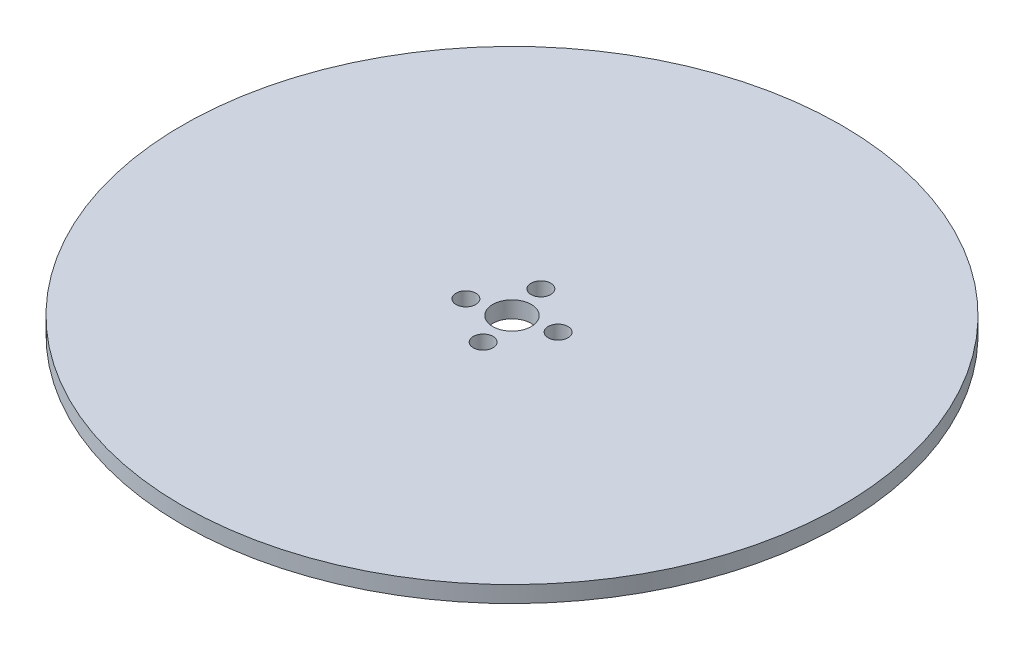
ISO-10303-21;
HEADER;
FILE_DESCRIPTION(('STEP AP214'),'2;1');
FILE_NAME('part.step','',(''),(''),'','','');
FILE_SCHEMA(('AUTOMOTIVE_DESIGN { 1 0 10303 214 1 1 1 1 }'));
ENDSEC;
DATA;
#1=APPLICATION_CONTEXT('core data for automotive mechanical design processes');
#2=APPLICATION_PROTOCOL_DEFINITION('international standard','automotive_design',2000,#1);
#3=PRODUCT_CONTEXT('',#1,'mechanical');
#4=PRODUCT('Part','Part','',(#3));
#5=PRODUCT_RELATED_PRODUCT_CATEGORY('part','',(#4));
#6=PRODUCT_DEFINITION_FORMATION('','',#4);
#7=PRODUCT_DEFINITION_CONTEXT('part definition',#1,'design');
#8=PRODUCT_DEFINITION('design','',#6,#7);
#9=PRODUCT_DEFINITION_SHAPE('','',#8);
#10=(LENGTH_UNIT() NAMED_UNIT(*) SI_UNIT(.MILLI.,.METRE.));
#11=(NAMED_UNIT(*) PLANE_ANGLE_UNIT() SI_UNIT($,.RADIAN.));
#12=(NAMED_UNIT(*) SI_UNIT($,.STERADIAN.) SOLID_ANGLE_UNIT());
#13=UNCERTAINTY_MEASURE_WITH_UNIT(LENGTH_MEASURE(1.E-05),#10,'distance_accuracy_value','');
#14=(GEOMETRIC_REPRESENTATION_CONTEXT(3) GLOBAL_UNCERTAINTY_ASSIGNED_CONTEXT((#13)) GLOBAL_UNIT_ASSIGNED_CONTEXT((#10,
#11,#12)) REPRESENTATION_CONTEXT('',''));
#15=CARTESIAN_POINT('',(0.,0.,0.));
#16=DIRECTION('',(0.,0.,1.));
#17=DIRECTION('',(1.,0.,0.));
#18=AXIS2_PLACEMENT_3D('',#15,#16,#17);
#19=CARTESIAN_POINT('',(0.,0.,0.));
#20=DIRECTION('',(0.,1.,0.));
#21=DIRECTION('',(0.,0.,1.));
#22=AXIS2_PLACEMENT_3D('',#19,#20,#21);
#23=PLANE('',#22);
#24=CARTESIAN_POINT('',(1.56993281036772,0.,6.82167948315744));
#25=DIRECTION('',(0.,-1.,0.));
#26=DIRECTION('',(0.,0.,-1.));
#27=AXIS2_PLACEMENT_3D('',#24,#25,#26);
#28=CIRCLE('',#27,1.8);
#29=CARTESIAN_POINT('',(1.56993281036772,0.,5.02167948315744));
#30=VERTEX_POINT('',#29);
#31=EDGE_CURVE('E58',#30,#30,#28,.T.);
#32=ORIENTED_EDGE('',*,*,#31,.F.);
#33=EDGE_LOOP('',(#32));
#34=FACE_BOUND('',#33,.T.);
#35=CARTESIAN_POINT('',(6.82167948315939,0.,-1.56993281036648));
#36=DIRECTION('',(0.,-1.,0.));
#37=DIRECTION('',(0.,0.,-1.));
#38=AXIS2_PLACEMENT_3D('',#35,#36,#37);
#39=CIRCLE('',#38,1.8);
#40=CARTESIAN_POINT('',(6.82167948315939,0.,-3.36993281036648));
#41=VERTEX_POINT('',#40);
#42=EDGE_CURVE('E64',#41,#41,#39,.T.);
#43=ORIENTED_EDGE('',*,*,#42,.F.);
#44=EDGE_LOOP('',(#43));
#45=FACE_BOUND('',#44,.T.);
#46=CARTESIAN_POINT('',(-1.56993281036454,0.,-6.82167948315814));
#47=DIRECTION('',(0.,-1.,0.));
#48=DIRECTION('',(0.,0.,-1.));
#49=AXIS2_PLACEMENT_3D('',#46,#47,#48);
#50=CIRCLE('',#49,1.8);
#51=CARTESIAN_POINT('',(-1.56993281036454,0.,-8.62167948315814));
#52=VERTEX_POINT('',#51);
#53=EDGE_CURVE('E65',#52,#52,#50,.T.);
#54=ORIENTED_EDGE('',*,*,#53,.F.);
#55=EDGE_LOOP('',(#54));
#56=FACE_BOUND('',#55,.T.);
#57=CARTESIAN_POINT('',(-6.8216794831562,0.,1.56993281036577));
#58=DIRECTION('',(0.,-1.,0.));
#59=DIRECTION('',(0.,0.,-1.));
#60=AXIS2_PLACEMENT_3D('',#57,#58,#59);
#61=CIRCLE('',#60,1.8);
#62=CARTESIAN_POINT('',(-6.8216794831562,0.,-0.230067189634225));
#63=VERTEX_POINT('',#62);
#64=EDGE_CURVE('E76',#63,#63,#61,.T.);
#65=ORIENTED_EDGE('',*,*,#64,.F.);
#66=EDGE_LOOP('',(#65));
#67=FACE_BOUND('',#66,.T.);
#68=CARTESIAN_POINT('',(0.,0.,0.));
#69=DIRECTION('',(0.,-1.,0.));
#70=DIRECTION('',(0.,0.,-1.));
#71=AXIS2_PLACEMENT_3D('',#68,#69,#70);
#72=CIRCLE('',#71,3.5);
#73=CARTESIAN_POINT('',(0.,0.,-3.5));
#74=VERTEX_POINT('',#73);
#75=EDGE_CURVE('E53',#74,#74,#72,.T.);
#76=ORIENTED_EDGE('',*,*,#75,.F.);
#77=EDGE_LOOP('',(#76));
#78=FACE_BOUND('',#77,.T.);
#79=CARTESIAN_POINT('',(0.,0.,0.));
#80=DIRECTION('',(0.,-1.,0.));
#81=DIRECTION('',(0.,0.,-1.));
#82=AXIS2_PLACEMENT_3D('',#79,#80,#81);
#83=CIRCLE('',#82,36.);
#84=CARTESIAN_POINT('',(0.,0.,-36.));
#85=VERTEX_POINT('',#84);
#86=EDGE_CURVE('E85',#85,#85,#83,.T.);
#87=ORIENTED_EDGE('',*,*,#86,.T.);
#88=EDGE_LOOP('',(#87));
#89=FACE_BOUND('',#88,.T.);
#90=ADVANCED_FACE('F37',(#34,#45,#56,#67,#78,#89),#23,.F.);
#91=CARTESIAN_POINT('',(0.,3.,0.));
#92=DIRECTION('',(0.,-1.,0.));
#93=DIRECTION('',(0.,0.,-1.));
#94=AXIS2_PLACEMENT_3D('',#91,#92,#93);
#95=CYLINDRICAL_SURFACE('',#94,60.);
#96=CARTESIAN_POINT('',(0.,3.,0.));
#97=DIRECTION('',(0.,1.,0.));
#98=DIRECTION('',(0.,0.,1.));
#99=AXIS2_PLACEMENT_3D('',#96,#97,#98);
#100=CIRCLE('',#99,60.);
#101=CARTESIAN_POINT('',(0.,3.,60.));
#102=VERTEX_POINT('',#101);
#103=EDGE_CURVE('E44',#102,#102,#100,.T.);
#104=ORIENTED_EDGE('',*,*,#103,.F.);
#105=EDGE_LOOP('',(#104));
#106=FACE_BOUND('',#105,.T.);
#107=CARTESIAN_POINT('',(0.,0.,0.));
#108=DIRECTION('',(0.,1.,0.));
#109=DIRECTION('',(0.,0.,1.));
#110=AXIS2_PLACEMENT_3D('',#107,#108,#109);
#111=CIRCLE('',#110,60.);
#112=CARTESIAN_POINT('',(0.,0.,60.));
#113=VERTEX_POINT('',#112);
#114=EDGE_CURVE('E48',#113,#113,#111,.T.);
#115=ORIENTED_EDGE('',*,*,#114,.T.);
#116=EDGE_LOOP('',(#115));
#117=FACE_BOUND('',#116,.T.);
#118=ADVANCED_FACE('F39',(#106,#117),#95,.T.);
#119=CARTESIAN_POINT('',(0.,3.,0.));
#120=DIRECTION('',(0.,1.,0.));
#121=DIRECTION('',(0.,0.,1.));
#122=AXIS2_PLACEMENT_3D('',#119,#120,#121);
#123=PLANE('',#122);
#124=CARTESIAN_POINT('',(1.56993281036772,3.,6.82167948315744));
#125=DIRECTION('',(0.,1.,0.));
#126=DIRECTION('',(0.,0.,1.));
#127=AXIS2_PLACEMENT_3D('',#124,#125,#126);
#128=CIRCLE('',#127,1.8);
#129=CARTESIAN_POINT('',(1.56993281036772,3.,8.62167948315744));
#130=VERTEX_POINT('',#129);
#131=EDGE_CURVE('E68',#130,#130,#128,.F.);
#132=ORIENTED_EDGE('',*,*,#131,.T.);
#133=EDGE_LOOP('',(#132));
#134=FACE_BOUND('',#133,.T.);
#135=CARTESIAN_POINT('',(6.82167948315939,3.,-1.56993281036648));
#136=DIRECTION('',(0.,1.,0.));
#137=DIRECTION('',(0.,0.,1.));
#138=AXIS2_PLACEMENT_3D('',#135,#136,#137);
#139=CIRCLE('',#138,1.8);
#140=CARTESIAN_POINT('',(6.82167948315939,3.,0.230067189633523));
#141=VERTEX_POINT('',#140);
#142=EDGE_CURVE('E61',#141,#141,#139,.F.);
#143=ORIENTED_EDGE('',*,*,#142,.T.);
#144=EDGE_LOOP('',(#143));
#145=FACE_BOUND('',#144,.T.);
#146=CARTESIAN_POINT('',(-1.56993281036454,3.,-6.82167948315814));
#147=DIRECTION('',(0.,1.,0.));
#148=DIRECTION('',(0.,0.,1.));
#149=AXIS2_PLACEMENT_3D('',#146,#147,#148);
#150=CIRCLE('',#149,1.8);
#151=CARTESIAN_POINT('',(-1.56993281036454,3.,-5.02167948315815));
#152=VERTEX_POINT('',#151);
#153=EDGE_CURVE('E80',#152,#152,#150,.F.);
#154=ORIENTED_EDGE('',*,*,#153,.T.);
#155=EDGE_LOOP('',(#154));
#156=FACE_BOUND('',#155,.T.);
#157=CARTESIAN_POINT('',(-6.8216794831562,3.,1.56993281036577));
#158=DIRECTION('',(0.,1.,0.));
#159=DIRECTION('',(0.,0.,1.));
#160=AXIS2_PLACEMENT_3D('',#157,#158,#159);
#161=CIRCLE('',#160,1.8);
#162=CARTESIAN_POINT('',(-6.8216794831562,3.,3.36993281036577));
#163=VERTEX_POINT('',#162);
#164=EDGE_CURVE('E73',#163,#163,#161,.F.);
#165=ORIENTED_EDGE('',*,*,#164,.T.);
#166=EDGE_LOOP('',(#165));
#167=FACE_BOUND('',#166,.T.);
#168=CARTESIAN_POINT('',(0.,3.,0.));
#169=DIRECTION('',(0.,1.,0.));
#170=DIRECTION('',(0.,0.,1.));
#171=AXIS2_PLACEMENT_3D('',#168,#169,#170);
#172=CIRCLE('',#171,3.5);
#173=CARTESIAN_POINT('',(0.,3.,3.5));
#174=VERTEX_POINT('',#173);
#175=EDGE_CURVE('E55',#174,#174,#172,.F.);
#176=ORIENTED_EDGE('',*,*,#175,.T.);
#177=EDGE_LOOP('',(#176));
#178=FACE_BOUND('',#177,.T.);
#179=ORIENTED_EDGE('',*,*,#103,.T.);
#180=EDGE_LOOP('',(#179));
#181=FACE_BOUND('',#180,.T.);
#182=ADVANCED_FACE('F117',(#134,#145,#156,#167,#178,#181),#123,.T.);
#183=CARTESIAN_POINT('',(0.,0.,0.));
#184=DIRECTION('',(0.,1.,0.));
#185=DIRECTION('',(0.,0.,1.));
#186=AXIS2_PLACEMENT_3D('',#183,#184,#185);
#187=CIRCLE('',#186,54.);
#188=CARTESIAN_POINT('',(0.,0.,54.));
#189=VERTEX_POINT('',#188);
#190=EDGE_CURVE('E10',#189,#189,#187,.F.);
#191=ORIENTED_EDGE('',*,*,#190,.F.);
#192=EDGE_LOOP('',(#191));
#193=FACE_BOUND('',#192,.T.);
#194=ORIENTED_EDGE('',*,*,#114,.F.);
#195=EDGE_LOOP('',(#194));
#196=FACE_BOUND('',#195,.T.);
#197=ADVANCED_FACE('F113',(#193,#196),#23,.F.);
#198=CARTESIAN_POINT('',(0.,3.001,0.));
#199=DIRECTION('',(0.,-1.,0.));
#200=DIRECTION('',(0.,0.,-1.));
#201=AXIS2_PLACEMENT_3D('',#198,#199,#200);
#202=CYLINDRICAL_SURFACE('',#201,3.5);
#203=ORIENTED_EDGE('',*,*,#175,.F.);
#204=EDGE_LOOP('',(#203));
#205=FACE_BOUND('',#204,.T.);
#206=ORIENTED_EDGE('',*,*,#75,.T.);
#207=EDGE_LOOP('',(#206));
#208=FACE_BOUND('',#207,.T.);
#209=ADVANCED_FACE('F123',(#205,#208),#202,.F.);
#210=CARTESIAN_POINT('',(-6.8216794831562,3.001,1.56993281036577));
#211=DIRECTION('',(0.,-1.,0.));
#212=DIRECTION('',(0.,0.,-1.));
#213=AXIS2_PLACEMENT_3D('',#210,#211,#212);
#214=CYLINDRICAL_SURFACE('',#213,1.8);
#215=ORIENTED_EDGE('',*,*,#164,.F.);
#216=EDGE_LOOP('',(#215));
#217=FACE_BOUND('',#216,.T.);
#218=ORIENTED_EDGE('',*,*,#64,.T.);
#219=EDGE_LOOP('',(#218));
#220=FACE_BOUND('',#219,.T.);
#221=ADVANCED_FACE('F129',(#217,#220),#214,.F.);
#222=CARTESIAN_POINT('',(-1.56993281036454,3.001,-6.82167948315814));
#223=DIRECTION('',(0.,-1.,0.));
#224=DIRECTION('',(0.,0.,-1.));
#225=AXIS2_PLACEMENT_3D('',#222,#223,#224);
#226=CYLINDRICAL_SURFACE('',#225,1.8);
#227=ORIENTED_EDGE('',*,*,#153,.F.);
#228=EDGE_LOOP('',(#227));
#229=FACE_BOUND('',#228,.T.);
#230=ORIENTED_EDGE('',*,*,#53,.T.);
#231=EDGE_LOOP('',(#230));
#232=FACE_BOUND('',#231,.T.);
#233=ADVANCED_FACE('F143',(#229,#232),#226,.F.);
#234=CARTESIAN_POINT('',(6.82167948315939,3.001,-1.56993281036648));
#235=DIRECTION('',(0.,-1.,0.));
#236=DIRECTION('',(0.,0.,-1.));
#237=AXIS2_PLACEMENT_3D('',#234,#235,#236);
#238=CYLINDRICAL_SURFACE('',#237,1.8);
#239=ORIENTED_EDGE('',*,*,#142,.F.);
#240=EDGE_LOOP('',(#239));
#241=FACE_BOUND('',#240,.T.);
#242=ORIENTED_EDGE('',*,*,#42,.T.);
#243=EDGE_LOOP('',(#242));
#244=FACE_BOUND('',#243,.T.);
#245=ADVANCED_FACE('F140',(#241,#244),#238,.F.);
#246=CARTESIAN_POINT('',(1.56993281036772,3.001,6.82167948315744));
#247=DIRECTION('',(0.,-1.,0.));
#248=DIRECTION('',(0.,0.,-1.));
#249=AXIS2_PLACEMENT_3D('',#246,#247,#248);
#250=CYLINDRICAL_SURFACE('',#249,1.8);
#251=ORIENTED_EDGE('',*,*,#131,.F.);
#252=EDGE_LOOP('',(#251));
#253=FACE_BOUND('',#252,.T.);
#254=ORIENTED_EDGE('',*,*,#31,.T.);
#255=EDGE_LOOP('',(#254));
#256=FACE_BOUND('',#255,.T.);
#257=ADVANCED_FACE('F109',(#253,#256),#250,.F.);
#258=CARTESIAN_POINT('',(0.,-3.,0.));
#259=DIRECTION('',(0.,1.,0.));
#260=DIRECTION('',(0.,0.,1.));
#261=AXIS2_PLACEMENT_3D('',#258,#259,#260);
#262=CYLINDRICAL_SURFACE('',#261,36.);
#263=CARTESIAN_POINT('',(0.,-3.,0.));
#264=DIRECTION('',(0.,-1.,0.));
#265=DIRECTION('',(0.,0.,-1.));
#266=AXIS2_PLACEMENT_3D('',#263,#264,#265);
#267=CIRCLE('',#266,36.);
#268=CARTESIAN_POINT('',(0.,-3.,-36.));
#269=VERTEX_POINT('',#268);
#270=EDGE_CURVE('E88',#269,#269,#267,.T.);
#271=ORIENTED_EDGE('',*,*,#270,.T.);
#272=EDGE_LOOP('',(#271));
#273=FACE_BOUND('',#272,.T.);
#274=ORIENTED_EDGE('',*,*,#86,.F.);
#275=EDGE_LOOP('',(#274));
#276=FACE_BOUND('',#275,.T.);
#277=ADVANCED_FACE('F94',(#273,#276),#262,.F.);
#278=CARTESIAN_POINT('',(0.,-3.,0.));
#279=DIRECTION('',(0.,1.,0.));
#280=DIRECTION('',(0.,0.,1.));
#281=AXIS2_PLACEMENT_3D('',#278,#279,#280);
#282=CYLINDRICAL_SURFACE('',#281,54.);
#283=CARTESIAN_POINT('',(0.,-3.,0.));
#284=DIRECTION('',(0.,-1.,0.));
#285=DIRECTION('',(0.,0.,-1.));
#286=AXIS2_PLACEMENT_3D('',#283,#284,#285);
#287=CIRCLE('',#286,54.);
#288=CARTESIAN_POINT('',(0.,-3.,-54.));
#289=VERTEX_POINT('',#288);
#290=EDGE_CURVE('E77',#289,#289,#287,.T.);
#291=ORIENTED_EDGE('',*,*,#290,.F.);
#292=EDGE_LOOP('',(#291));
#293=FACE_BOUND('',#292,.T.);
#294=ORIENTED_EDGE('',*,*,#190,.T.);
#295=EDGE_LOOP('',(#294));
#296=FACE_BOUND('',#295,.T.);
#297=ADVANCED_FACE('F100',(#293,#296),#282,.T.);
#298=CARTESIAN_POINT('',(0.,-3.,0.));
#299=DIRECTION('',(0.,-1.,0.));
#300=DIRECTION('',(0.,0.,-1.));
#301=AXIS2_PLACEMENT_3D('',#298,#299,#300);
#302=PLANE('',#301);
#303=ORIENTED_EDGE('',*,*,#270,.F.);
#304=EDGE_LOOP('',(#303));
#305=FACE_BOUND('',#304,.T.);
#306=ORIENTED_EDGE('',*,*,#290,.T.);
#307=EDGE_LOOP('',(#306));
#308=FACE_BOUND('',#307,.T.);
#309=ADVANCED_FACE('F97',(#305,#308),#302,.T.);
#310=CLOSED_SHELL('',(#90,#118,#182,#197,#209,#221,#233,#245,#257,#277,#297,#309));
#311=MANIFOLD_SOLID_BREP('B2',#310);
#312=ADVANCED_BREP_SHAPE_REPRESENTATION('',(#18,#311),#14);
#313=SHAPE_DEFINITION_REPRESENTATION(#9,#312);
ENDSEC;
END-ISO-10303-21;
